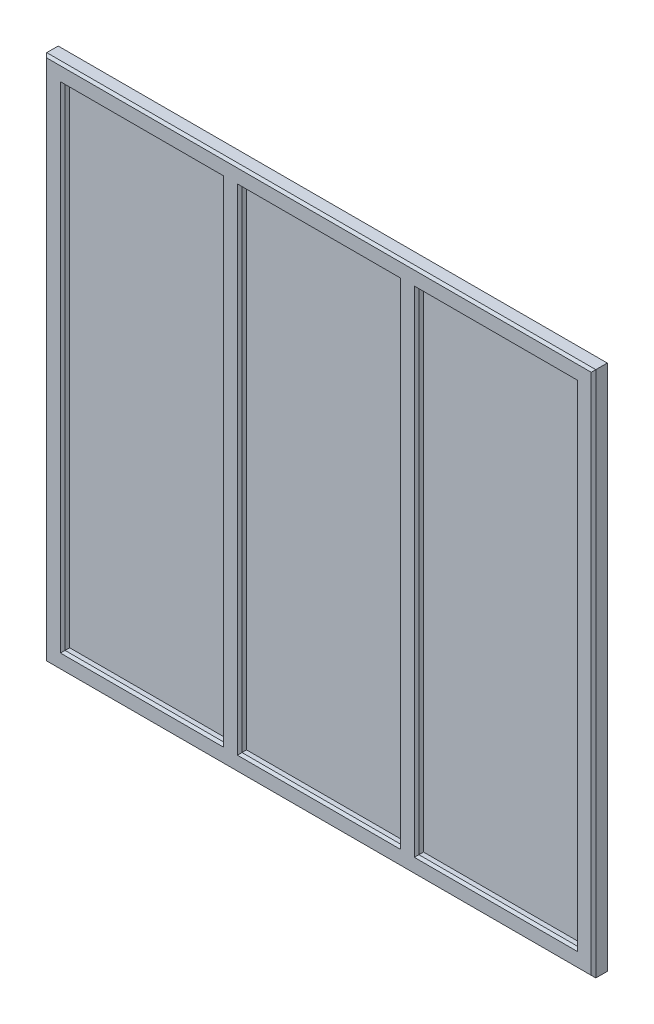
ISO-10303-21;
HEADER;
FILE_DESCRIPTION(('STEP AP214'),'2;1');
FILE_NAME('part.step','',(''),(''),'','','');
FILE_SCHEMA(('AUTOMOTIVE_DESIGN { 1 0 10303 214 1 1 1 1 }'));
ENDSEC;
DATA;
#1=APPLICATION_CONTEXT('core data for automotive mechanical design processes');
#2=APPLICATION_PROTOCOL_DEFINITION('international standard','automotive_design',2000,#1);
#3=PRODUCT_CONTEXT('',#1,'mechanical');
#4=PRODUCT('Part','Part','',(#3));
#5=PRODUCT_RELATED_PRODUCT_CATEGORY('part','',(#4));
#6=PRODUCT_DEFINITION_FORMATION('','',#4);
#7=PRODUCT_DEFINITION_CONTEXT('part definition',#1,'design');
#8=PRODUCT_DEFINITION('design','',#6,#7);
#9=PRODUCT_DEFINITION_SHAPE('','',#8);
#10=(LENGTH_UNIT() NAMED_UNIT(*) SI_UNIT(.MILLI.,.METRE.));
#11=(NAMED_UNIT(*) PLANE_ANGLE_UNIT() SI_UNIT($,.RADIAN.));
#12=(NAMED_UNIT(*) SI_UNIT($,.STERADIAN.) SOLID_ANGLE_UNIT());
#13=UNCERTAINTY_MEASURE_WITH_UNIT(LENGTH_MEASURE(1.E-05),#10,'distance_accuracy_value','');
#14=(GEOMETRIC_REPRESENTATION_CONTEXT(3) GLOBAL_UNCERTAINTY_ASSIGNED_CONTEXT((#13)) GLOBAL_UNIT_ASSIGNED_CONTEXT((#10,
#11,#12)) REPRESENTATION_CONTEXT('',''));
#15=CARTESIAN_POINT('',(0.,0.,0.));
#16=DIRECTION('',(0.,0.,1.));
#17=DIRECTION('',(1.,0.,0.));
#18=AXIS2_PLACEMENT_3D('',#15,#16,#17);
#19=CARTESIAN_POINT('',(2364.27043454507,2265.94362040315,30.));
#20=DIRECTION('',(1.,0.,0.));
#21=DIRECTION('',(0.,0.,-1.));
#22=AXIS2_PLACEMENT_3D('',#19,#20,#21);
#23=PLANE('',#22);
#24=DIRECTION('',(0.,-1.,0.));
#25=VECTOR('',#24,1.);
#26=CARTESIAN_POINT('',(2364.27043454507,2265.94362040315,20.));
#27=LINE('',#26,#25);
#28=CARTESIAN_POINT('',(2364.27043454507,2265.94362040315,20.));
#29=VERTEX_POINT('',#28);
#30=CARTESIAN_POINT('',(2364.27043454507,48.4287182260568,20.));
#31=VERTEX_POINT('',#30);
#32=EDGE_CURVE('E118',#29,#31,#27,.T.);
#33=ORIENTED_EDGE('',*,*,#32,.F.);
#34=DIRECTION('',(0.,0.,-1.));
#35=VECTOR('',#34,1.);
#36=CARTESIAN_POINT('',(2364.27043454507,2265.94362040315,30.));
#37=LINE('',#36,#35);
#38=CARTESIAN_POINT('',(2364.27043454507,2265.94362040315,30.));
#39=VERTEX_POINT('',#38);
#40=EDGE_CURVE('E12',#39,#29,#37,.T.);
#41=ORIENTED_EDGE('',*,*,#40,.F.);
#42=DIRECTION('',(0.,-1.,0.));
#43=VECTOR('',#42,1.);
#44=CARTESIAN_POINT('',(2364.27043454507,2265.94362040315,30.));
#45=LINE('',#44,#43);
#46=CARTESIAN_POINT('',(2364.27043454507,48.4287182260568,30.));
#47=VERTEX_POINT('',#46);
#48=EDGE_CURVE('E112',#39,#47,#45,.T.);
#49=ORIENTED_EDGE('',*,*,#48,.T.);
#50=DIRECTION('',(0.,0.,-1.));
#51=VECTOR('',#50,1.);
#52=CARTESIAN_POINT('',(2364.27043454507,48.4287182260568,30.));
#53=LINE('',#52,#51);
#54=EDGE_CURVE('E57',#47,#31,#53,.T.);
#55=ORIENTED_EDGE('',*,*,#54,.T.);
#56=EDGE_LOOP('',(#33,#41,#49,#55));
#57=FACE_BOUND('',#56,.T.);
#58=ADVANCED_FACE('F54',(#57),#23,.T.);
#59=CARTESIAN_POINT('',(2364.27043454507,2265.94362040315,30.));
#60=DIRECTION('',(0.,1.,0.));
#61=DIRECTION('',(0.,0.,1.));
#62=AXIS2_PLACEMENT_3D('',#59,#60,#61);
#63=PLANE('',#62);
#64=DIRECTION('',(1.,0.,0.));
#65=VECTOR('',#64,1.);
#66=CARTESIAN_POINT('',(2364.27043454507,2265.94362040315,20.));
#67=LINE('',#66,#65);
#68=CARTESIAN_POINT('',(56.6650057793351,2265.94362040315,20.));
#69=VERTEX_POINT('',#68);
#70=EDGE_CURVE('E114',#69,#29,#67,.T.);
#71=ORIENTED_EDGE('',*,*,#70,.F.);
#72=DIRECTION('',(0.,0.,-1.));
#73=VECTOR('',#72,1.);
#74=CARTESIAN_POINT('',(56.6650057793351,2265.94362040315,30.));
#75=LINE('',#74,#73);
#76=CARTESIAN_POINT('',(56.6650057793351,2265.94362040315,30.));
#77=VERTEX_POINT('',#76);
#78=EDGE_CURVE('E63',#77,#69,#75,.T.);
#79=ORIENTED_EDGE('',*,*,#78,.F.);
#80=DIRECTION('',(1.,0.,0.));
#81=VECTOR('',#80,1.);
#82=CARTESIAN_POINT('',(2364.27043454507,2265.94362040315,30.));
#83=LINE('',#82,#81);
#84=EDGE_CURVE('E109',#77,#39,#83,.T.);
#85=ORIENTED_EDGE('',*,*,#84,.T.);
#86=ORIENTED_EDGE('',*,*,#40,.T.);
#87=EDGE_LOOP('',(#71,#79,#85,#86));
#88=FACE_BOUND('',#87,.T.);
#89=ADVANCED_FACE('F128',(#88),#63,.T.);
#90=CARTESIAN_POINT('',(56.6650057793351,2265.94362040315,30.));
#91=DIRECTION('',(-1.,0.,0.));
#92=DIRECTION('',(0.,-1.,0.));
#93=AXIS2_PLACEMENT_3D('',#90,#91,#92);
#94=PLANE('',#93);
#95=DIRECTION('',(0.,1.,0.));
#96=VECTOR('',#95,1.);
#97=CARTESIAN_POINT('',(56.6650057793351,2265.94362040315,20.));
#98=LINE('',#97,#96);
#99=CARTESIAN_POINT('',(56.665005779335,48.4287182260568,20.));
#100=VERTEX_POINT('',#99);
#101=EDGE_CURVE('E104',#100,#69,#98,.T.);
#102=ORIENTED_EDGE('',*,*,#101,.F.);
#103=DIRECTION('',(0.,0.,-1.));
#104=VECTOR('',#103,1.);
#105=CARTESIAN_POINT('',(56.665005779335,48.4287182260568,30.));
#106=LINE('',#105,#104);
#107=CARTESIAN_POINT('',(56.665005779335,48.4287182260568,30.));
#108=VERTEX_POINT('',#107);
#109=EDGE_CURVE('E99',#108,#100,#106,.T.);
#110=ORIENTED_EDGE('',*,*,#109,.F.);
#111=DIRECTION('',(0.,1.,0.));
#112=VECTOR('',#111,1.);
#113=CARTESIAN_POINT('',(56.6650057793351,2265.94362040315,30.));
#114=LINE('',#113,#112);
#115=EDGE_CURVE('E102',#108,#77,#114,.T.);
#116=ORIENTED_EDGE('',*,*,#115,.T.);
#117=ORIENTED_EDGE('',*,*,#78,.T.);
#118=EDGE_LOOP('',(#102,#110,#116,#117));
#119=FACE_BOUND('',#118,.T.);
#120=ADVANCED_FACE('F101',(#119),#94,.T.);
#121=CARTESIAN_POINT('',(2364.27043454507,48.4287182260568,30.));
#122=DIRECTION('',(0.,-1.,0.));
#123=DIRECTION('',(0.,0.,-1.));
#124=AXIS2_PLACEMENT_3D('',#121,#122,#123);
#125=PLANE('',#124);
#126=DIRECTION('',(-1.,0.,0.));
#127=VECTOR('',#126,1.);
#128=CARTESIAN_POINT('',(2364.27043454507,48.4287182260568,20.));
#129=LINE('',#128,#127);
#130=EDGE_CURVE('E121',#31,#100,#129,.T.);
#131=ORIENTED_EDGE('',*,*,#130,.F.);
#132=ORIENTED_EDGE('',*,*,#54,.F.);
#133=DIRECTION('',(-1.,0.,0.));
#134=VECTOR('',#133,1.);
#135=CARTESIAN_POINT('',(2364.27043454507,48.4287182260568,30.));
#136=LINE('',#135,#134);
#137=EDGE_CURVE('E108',#47,#108,#136,.T.);
#138=ORIENTED_EDGE('',*,*,#137,.T.);
#139=ORIENTED_EDGE('',*,*,#109,.T.);
#140=EDGE_LOOP('',(#131,#132,#138,#139));
#141=FACE_BOUND('',#140,.T.);
#142=ADVANCED_FACE('F111',(#141),#125,.T.);
#143=CARTESIAN_POINT('',(0.,0.,30.));
#144=DIRECTION('',(0.,0.,-1.));
#145=DIRECTION('',(-1.,0.,0.));
#146=AXIS2_PLACEMENT_3D('',#143,#144,#145);
#147=PLANE('',#146);
#148=ORIENTED_EDGE('',*,*,#48,.F.);
#149=ORIENTED_EDGE('',*,*,#84,.F.);
#150=ORIENTED_EDGE('',*,*,#115,.F.);
#151=ORIENTED_EDGE('',*,*,#137,.F.);
#152=EDGE_LOOP('',(#148,#149,#150,#151));
#153=FACE_BOUND('',#152,.T.);
#154=ADVANCED_FACE('F107',(#153),#147,.F.);
#155=CARTESIAN_POINT('',(0.,0.,20.));
#156=DIRECTION('',(0.,0.,-1.));
#157=DIRECTION('',(-1.,0.,0.));
#158=AXIS2_PLACEMENT_3D('',#155,#156,#157);
#159=PLANE('',#158);
#160=ORIENTED_EDGE('',*,*,#32,.T.);
#161=ORIENTED_EDGE('',*,*,#130,.T.);
#162=ORIENTED_EDGE('',*,*,#101,.T.);
#163=ORIENTED_EDGE('',*,*,#70,.T.);
#164=EDGE_LOOP('',(#160,#161,#162,#163));
#165=FACE_BOUND('',#164,.T.);
#166=ADVANCED_FACE('F127',(#165),#159,.T.);
#167=CLOSED_SHELL('',(#58,#89,#120,#142,#154,#166));
#168=MANIFOLD_SOLID_BREP('B2',#167);
#169=CARTESIAN_POINT('',(0.,0.,60.));
#170=DIRECTION('',(0.,0.,-1.));
#171=DIRECTION('',(-1.,0.,0.));
#172=AXIS2_PLACEMENT_3D('',#169,#170,#171);
#173=PLANE('',#172);
#174=DIRECTION('',(-1.,0.,0.));
#175=VECTOR('',#174,1.);
#176=CARTESIAN_POINT('',(852.333333333334,70.0000000000003,60.));
#177=LINE('',#176,#175);
#178=CARTESIAN_POINT('',(1554.66666666667,70.0000000000003,60.));
#179=VERTEX_POINT('',#178);
#180=CARTESIAN_POINT('',(842.333333333334,70.0000000000003,60.));
#181=VERTEX_POINT('',#180);
#182=EDGE_CURVE('E472',#179,#181,#177,.T.);
#183=ORIENTED_EDGE('',*,*,#182,.T.);
#184=DIRECTION('',(0.,1.,0.));
#185=VECTOR('',#184,1.);
#186=CARTESIAN_POINT('',(842.333333333334,2220.,60.));
#187=LINE('',#186,#185);
#188=CARTESIAN_POINT('',(842.333333333334,2230.,60.));
#189=VERTEX_POINT('',#188);
#190=EDGE_CURVE('E474',#181,#189,#187,.T.);
#191=ORIENTED_EDGE('',*,*,#190,.T.);
#192=DIRECTION('',(1.,0.,0.));
#193=VECTOR('',#192,1.);
#194=CARTESIAN_POINT('',(1544.66666666667,2230.,60.));
#195=LINE('',#194,#193);
#196=CARTESIAN_POINT('',(1554.66666666667,2230.,60.));
#197=VERTEX_POINT('',#196);
#198=EDGE_CURVE('E468',#189,#197,#195,.T.);
#199=ORIENTED_EDGE('',*,*,#198,.T.);
#200=DIRECTION('',(0.,-1.,0.));
#201=VECTOR('',#200,1.);
#202=CARTESIAN_POINT('',(1554.66666666667,80.0000000000001,60.));
#203=LINE('',#202,#201);
#204=EDGE_CURVE('E470',#197,#179,#203,.T.);
#205=ORIENTED_EDGE('',*,*,#204,.T.);
#206=EDGE_LOOP('',(#183,#191,#199,#205));
#207=FACE_BOUND('',#206,.T.);
#208=DIRECTION('',(1.,0.,0.));
#209=VECTOR('',#208,1.);
#210=CARTESIAN_POINT('',(772.333333333334,2230.,60.));
#211=LINE('',#210,#209);
#212=CARTESIAN_POINT('',(70.0000000000002,2230.,60.));
#213=VERTEX_POINT('',#212);
#214=CARTESIAN_POINT('',(782.333333333333,2230.,60.));
#215=VERTEX_POINT('',#214);
#216=EDGE_CURVE('E463',#213,#215,#211,.T.);
#217=ORIENTED_EDGE('',*,*,#216,.T.);
#218=DIRECTION('',(0.,-1.,0.));
#219=VECTOR('',#218,1.);
#220=CARTESIAN_POINT('',(782.333333333333,80.0000000000001,60.));
#221=LINE('',#220,#219);
#222=CARTESIAN_POINT('',(782.333333333333,70.0000000000003,60.));
#223=VERTEX_POINT('',#222);
#224=EDGE_CURVE('E465',#215,#223,#221,.T.);
#225=ORIENTED_EDGE('',*,*,#224,.T.);
#226=DIRECTION('',(-1.,0.,0.));
#227=VECTOR('',#226,1.);
#228=CARTESIAN_POINT('',(80.,70.0000000000002,60.));
#229=LINE('',#228,#227);
#230=CARTESIAN_POINT('',(70.0000000000002,70.0000000000002,60.));
#231=VERTEX_POINT('',#230);
#232=EDGE_CURVE('E459',#223,#231,#229,.T.);
#233=ORIENTED_EDGE('',*,*,#232,.T.);
#234=DIRECTION('',(0.,1.,0.));
#235=VECTOR('',#234,1.);
#236=CARTESIAN_POINT('',(70.0000000000002,2220.,60.));
#237=LINE('',#236,#235);
#238=EDGE_CURVE('E461',#231,#213,#237,.T.);
#239=ORIENTED_EDGE('',*,*,#238,.T.);
#240=EDGE_LOOP('',(#217,#225,#233,#239));
#241=FACE_BOUND('',#240,.T.);
#242=DIRECTION('',(0.,1.,0.));
#243=VECTOR('',#242,1.);
#244=CARTESIAN_POINT('',(2387.,0.,60.));
#245=LINE('',#244,#243);
#246=CARTESIAN_POINT('',(2387.,10.0000000000002,60.));
#247=VERTEX_POINT('',#246);
#248=CARTESIAN_POINT('',(2387.,2290.,60.));
#249=VERTEX_POINT('',#248);
#250=EDGE_CURVE('E454',#247,#249,#245,.T.);
#251=ORIENTED_EDGE('',*,*,#250,.T.);
#252=DIRECTION('',(-1.,0.,0.));
#253=VECTOR('',#252,1.);
#254=CARTESIAN_POINT('',(0.,2290.,60.));
#255=LINE('',#254,#253);
#256=CARTESIAN_POINT('',(10.0000000000002,2290.,60.));
#257=VERTEX_POINT('',#256);
#258=EDGE_CURVE('E456',#249,#257,#255,.T.);
#259=ORIENTED_EDGE('',*,*,#258,.T.);
#260=DIRECTION('',(0.,-1.,0.));
#261=VECTOR('',#260,1.);
#262=CARTESIAN_POINT('',(10.0000000000002,0.,60.));
#263=LINE('',#262,#261);
#264=CARTESIAN_POINT('',(10.0000000000002,10.0000000000002,60.));
#265=VERTEX_POINT('',#264);
#266=EDGE_CURVE('E450',#257,#265,#263,.T.);
#267=ORIENTED_EDGE('',*,*,#266,.T.);
#268=DIRECTION('',(1.,0.,0.));
#269=VECTOR('',#268,1.);
#270=CARTESIAN_POINT('',(0.,10.0000000000002,60.));
#271=LINE('',#270,#269);
#272=EDGE_CURVE('E452',#265,#247,#271,.T.);
#273=ORIENTED_EDGE('',*,*,#272,.T.);
#274=EDGE_LOOP('',(#251,#259,#267,#273));
#275=FACE_BOUND('',#274,.T.);
#276=DIRECTION('',(-1.,0.,0.));
#277=VECTOR('',#276,1.);
#278=CARTESIAN_POINT('',(1624.66666666667,70.0000000000003,60.));
#279=LINE('',#278,#277);
#280=CARTESIAN_POINT('',(2327.,70.0000000000002,60.));
#281=VERTEX_POINT('',#280);
#282=CARTESIAN_POINT('',(1614.66666666667,70.0000000000003,60.));
#283=VERTEX_POINT('',#282);
#284=EDGE_CURVE('E445',#281,#283,#279,.T.);
#285=ORIENTED_EDGE('',*,*,#284,.T.);
#286=DIRECTION('',(0.,1.,0.));
#287=VECTOR('',#286,1.);
#288=CARTESIAN_POINT('',(1614.66666666667,2220.,60.));
#289=LINE('',#288,#287);
#290=CARTESIAN_POINT('',(1614.66666666667,2230.,60.));
#291=VERTEX_POINT('',#290);
#292=EDGE_CURVE('E447',#283,#291,#289,.T.);
#293=ORIENTED_EDGE('',*,*,#292,.T.);
#294=DIRECTION('',(1.,0.,0.));
#295=VECTOR('',#294,1.);
#296=CARTESIAN_POINT('',(2317.,2230.,60.));
#297=LINE('',#296,#295);
#298=CARTESIAN_POINT('',(2327.,2230.,60.));
#299=VERTEX_POINT('',#298);
#300=EDGE_CURVE('E441',#291,#299,#297,.T.);
#301=ORIENTED_EDGE('',*,*,#300,.T.);
#302=DIRECTION('',(0.,-1.,0.));
#303=VECTOR('',#302,1.);
#304=CARTESIAN_POINT('',(2327.,80.,60.));
#305=LINE('',#304,#303);
#306=EDGE_CURVE('E443',#299,#281,#305,.T.);
#307=ORIENTED_EDGE('',*,*,#306,.T.);
#308=EDGE_LOOP('',(#285,#293,#301,#307));
#309=FACE_BOUND('',#308,.T.);
#310=ADVANCED_FACE('F177',(#207,#241,#275,#309),#173,.F.);
#311=CARTESIAN_POINT('',(0.,0.,0.));
#312=DIRECTION('',(0.,0.,-1.));
#313=DIRECTION('',(-1.,0.,0.));
#314=AXIS2_PLACEMENT_3D('',#311,#312,#313);
#315=PLANE('',#314);
#316=DIRECTION('',(0.,-1.,0.));
#317=VECTOR('',#316,1.);
#318=CARTESIAN_POINT('',(0.,0.,0.));
#319=LINE('',#318,#317);
#320=CARTESIAN_POINT('',(0.,2300.,0.));
#321=VERTEX_POINT('',#320);
#322=CARTESIAN_POINT('',(0.,0.,0.));
#323=VERTEX_POINT('',#322);
#324=EDGE_CURVE('E419',#321,#323,#319,.T.);
#325=ORIENTED_EDGE('',*,*,#324,.F.);
#326=DIRECTION('',(-1.,0.,0.));
#327=VECTOR('',#326,1.);
#328=CARTESIAN_POINT('',(0.,2300.,0.));
#329=LINE('',#328,#327);
#330=CARTESIAN_POINT('',(2397.,2300.,0.));
#331=VERTEX_POINT('',#330);
#332=EDGE_CURVE('E428',#331,#321,#329,.T.);
#333=ORIENTED_EDGE('',*,*,#332,.F.);
#334=DIRECTION('',(0.,1.,0.));
#335=VECTOR('',#334,1.);
#336=CARTESIAN_POINT('',(2397.,0.,0.));
#337=LINE('',#336,#335);
#338=CARTESIAN_POINT('',(2397.,0.,0.));
#339=VERTEX_POINT('',#338);
#340=EDGE_CURVE('E425',#339,#331,#337,.T.);
#341=ORIENTED_EDGE('',*,*,#340,.F.);
#342=DIRECTION('',(1.,0.,0.));
#343=VECTOR('',#342,1.);
#344=CARTESIAN_POINT('',(0.,0.,0.));
#345=LINE('',#344,#343);
#346=EDGE_CURVE('E422',#323,#339,#345,.T.);
#347=ORIENTED_EDGE('',*,*,#346,.F.);
#348=EDGE_LOOP('',(#325,#333,#341,#347));
#349=FACE_BOUND('',#348,.T.);
#350=DIRECTION('',(0.,-1.,0.));
#351=VECTOR('',#350,1.);
#352=CARTESIAN_POINT('',(80.,80.,0.));
#353=LINE('',#352,#351);
#354=CARTESIAN_POINT('',(80.,2220.,0.));
#355=VERTEX_POINT('',#354);
#356=CARTESIAN_POINT('',(80.,80.,0.));
#357=VERTEX_POINT('',#356);
#358=EDGE_CURVE('E408',#355,#357,#353,.T.);
#359=ORIENTED_EDGE('',*,*,#358,.T.);
#360=DIRECTION('',(1.,0.,0.));
#361=VECTOR('',#360,1.);
#362=CARTESIAN_POINT('',(80.,80.,0.));
#363=LINE('',#362,#361);
#364=CARTESIAN_POINT('',(772.333333333334,80.0000000000001,0.));
#365=VERTEX_POINT('',#364);
#366=EDGE_CURVE('E399',#357,#365,#363,.T.);
#367=ORIENTED_EDGE('',*,*,#366,.T.);
#368=DIRECTION('',(0.,1.,0.));
#369=VECTOR('',#368,1.);
#370=CARTESIAN_POINT('',(772.333333333334,2220.,0.));
#371=LINE('',#370,#369);
#372=CARTESIAN_POINT('',(772.333333333334,2220.,0.));
#373=VERTEX_POINT('',#372);
#374=EDGE_CURVE('E402',#365,#373,#371,.T.);
#375=ORIENTED_EDGE('',*,*,#374,.T.);
#376=DIRECTION('',(-1.,0.,0.));
#377=VECTOR('',#376,1.);
#378=CARTESIAN_POINT('',(80.,2220.,0.));
#379=LINE('',#378,#377);
#380=EDGE_CURVE('E405',#373,#355,#379,.T.);
#381=ORIENTED_EDGE('',*,*,#380,.T.);
#382=EDGE_LOOP('',(#359,#367,#375,#381));
#383=FACE_BOUND('',#382,.T.);
#384=DIRECTION('',(0.,1.,0.));
#385=VECTOR('',#384,1.);
#386=CARTESIAN_POINT('',(2317.,80.,0.));
#387=LINE('',#386,#385);
#388=CARTESIAN_POINT('',(2317.,80.,0.));
#389=VERTEX_POINT('',#388);
#390=CARTESIAN_POINT('',(2317.,2220.,0.));
#391=VERTEX_POINT('',#390);
#392=EDGE_CURVE('E388',#389,#391,#387,.T.);
#393=ORIENTED_EDGE('',*,*,#392,.T.);
#394=DIRECTION('',(-1.,0.,0.));
#395=VECTOR('',#394,1.);
#396=CARTESIAN_POINT('',(1624.66666666667,2220.,0.));
#397=LINE('',#396,#395);
#398=CARTESIAN_POINT('',(1624.66666666667,2220.,0.));
#399=VERTEX_POINT('',#398);
#400=EDGE_CURVE('E352',#391,#399,#397,.T.);
#401=ORIENTED_EDGE('',*,*,#400,.T.);
#402=DIRECTION('',(0.,-1.,0.));
#403=VECTOR('',#402,1.);
#404=CARTESIAN_POINT('',(1624.66666666667,2220.,0.));
#405=LINE('',#404,#403);
#406=CARTESIAN_POINT('',(1624.66666666667,80.0000000000001,0.));
#407=VERTEX_POINT('',#406);
#408=EDGE_CURVE('E382',#399,#407,#405,.T.);
#409=ORIENTED_EDGE('',*,*,#408,.T.);
#410=DIRECTION('',(1.,0.,0.));
#411=VECTOR('',#410,1.);
#412=CARTESIAN_POINT('',(1624.66666666667,80.0000000000001,0.));
#413=LINE('',#412,#411);
#414=EDGE_CURVE('E385',#407,#389,#413,.T.);
#415=ORIENTED_EDGE('',*,*,#414,.T.);
#416=EDGE_LOOP('',(#393,#401,#409,#415));
#417=FACE_BOUND('',#416,.T.);
#418=DIRECTION('',(0.,1.,0.));
#419=VECTOR('',#418,1.);
#420=CARTESIAN_POINT('',(1544.66666666667,2220.,0.));
#421=LINE('',#420,#419);
#422=CARTESIAN_POINT('',(1544.66666666667,80.0000000000001,0.));
#423=VERTEX_POINT('',#422);
#424=CARTESIAN_POINT('',(1544.66666666667,2220.,0.));
#425=VERTEX_POINT('',#424);
#426=EDGE_CURVE('E366',#423,#425,#421,.T.);
#427=ORIENTED_EDGE('',*,*,#426,.T.);
#428=DIRECTION('',(-1.,0.,0.));
#429=VECTOR('',#428,1.);
#430=CARTESIAN_POINT('',(852.333333333334,2220.,0.));
#431=LINE('',#430,#429);
#432=CARTESIAN_POINT('',(852.333333333334,2220.,0.));
#433=VERTEX_POINT('',#432);
#434=EDGE_CURVE('E345',#425,#433,#431,.T.);
#435=ORIENTED_EDGE('',*,*,#434,.T.);
#436=DIRECTION('',(0.,-1.,0.));
#437=VECTOR('',#436,1.);
#438=CARTESIAN_POINT('',(852.333333333334,2220.,0.));
#439=LINE('',#438,#437);
#440=CARTESIAN_POINT('',(852.333333333334,80.0000000000001,0.));
#441=VERTEX_POINT('',#440);
#442=EDGE_CURVE('E356',#433,#441,#439,.T.);
#443=ORIENTED_EDGE('',*,*,#442,.T.);
#444=DIRECTION('',(1.,0.,0.));
#445=VECTOR('',#444,1.);
#446=CARTESIAN_POINT('',(852.333333333334,80.0000000000001,0.));
#447=LINE('',#446,#445);
#448=EDGE_CURVE('E362',#441,#423,#447,.T.);
#449=ORIENTED_EDGE('',*,*,#448,.T.);
#450=EDGE_LOOP('',(#427,#435,#443,#449));
#451=FACE_BOUND('',#450,.T.);
#452=ADVANCED_FACE('F364',(#349,#383,#417,#451),#315,.T.);
#453=CARTESIAN_POINT('',(0.,0.,60.));
#454=DIRECTION('',(1.,0.,0.));
#455=DIRECTION('',(0.,0.,-1.));
#456=AXIS2_PLACEMENT_3D('',#453,#454,#455);
#457=PLANE('',#456);
#458=DIRECTION('',(0.,0.,-1.));
#459=VECTOR('',#458,1.);
#460=CARTESIAN_POINT('',(0.,0.,60.));
#461=LINE('',#460,#459);
#462=CARTESIAN_POINT('',(0.,0.,49.9999999999998));
#463=VERTEX_POINT('',#462);
#464=EDGE_CURVE('E437',#463,#323,#461,.T.);
#465=ORIENTED_EDGE('',*,*,#464,.F.);
#466=DIRECTION('',(0.,1.,0.));
#467=VECTOR('',#466,1.);
#468=CARTESIAN_POINT('',(0.,0.,49.9999999999998));
#469=LINE('',#468,#467);
#470=CARTESIAN_POINT('',(0.,2300.,49.9999999999998));
#471=VERTEX_POINT('',#470);
#472=EDGE_CURVE('E498',#463,#471,#469,.T.);
#473=ORIENTED_EDGE('',*,*,#472,.T.);
#474=DIRECTION('',(0.,0.,-1.));
#475=VECTOR('',#474,1.);
#476=CARTESIAN_POINT('',(0.,2300.,60.));
#477=LINE('',#476,#475);
#478=EDGE_CURVE('E431',#471,#321,#477,.T.);
#479=ORIENTED_EDGE('',*,*,#478,.T.);
#480=ORIENTED_EDGE('',*,*,#324,.T.);
#481=EDGE_LOOP('',(#465,#473,#479,#480));
#482=FACE_BOUND('',#481,.T.);
#483=ADVANCED_FACE('F582',(#482),#457,.F.);
#484=CARTESIAN_POINT('',(0.,0.,60.));
#485=DIRECTION('',(0.,1.,0.));
#486=DIRECTION('',(0.,0.,1.));
#487=AXIS2_PLACEMENT_3D('',#484,#485,#486);
#488=PLANE('',#487);
#489=DIRECTION('',(0.,0.,-1.));
#490=VECTOR('',#489,1.);
#491=CARTESIAN_POINT('',(2397.,0.,60.));
#492=LINE('',#491,#490);
#493=CARTESIAN_POINT('',(2397.,0.,49.9999999999998));
#494=VERTEX_POINT('',#493);
#495=EDGE_CURVE('E435',#494,#339,#492,.T.);
#496=ORIENTED_EDGE('',*,*,#495,.F.);
#497=DIRECTION('',(-1.,0.,0.));
#498=VECTOR('',#497,1.);
#499=CARTESIAN_POINT('',(0.,0.,49.9999999999998));
#500=LINE('',#499,#498);
#501=EDGE_CURVE('E496',#494,#463,#500,.T.);
#502=ORIENTED_EDGE('',*,*,#501,.T.);
#503=ORIENTED_EDGE('',*,*,#464,.T.);
#504=ORIENTED_EDGE('',*,*,#346,.T.);
#505=EDGE_LOOP('',(#496,#502,#503,#504));
#506=FACE_BOUND('',#505,.T.);
#507=ADVANCED_FACE('F597',(#506),#488,.F.);
#508=CARTESIAN_POINT('',(2397.,0.,60.));
#509=DIRECTION('',(-1.,0.,0.));
#510=DIRECTION('',(0.,0.,1.));
#511=AXIS2_PLACEMENT_3D('',#508,#509,#510);
#512=PLANE('',#511);
#513=DIRECTION('',(0.,0.,-1.));
#514=VECTOR('',#513,1.);
#515=CARTESIAN_POINT('',(2397.,2300.,60.));
#516=LINE('',#515,#514);
#517=CARTESIAN_POINT('',(2397.,2300.,49.9999999999998));
#518=VERTEX_POINT('',#517);
#519=EDGE_CURVE('E433',#518,#331,#516,.T.);
#520=ORIENTED_EDGE('',*,*,#519,.F.);
#521=DIRECTION('',(0.,-1.,0.));
#522=VECTOR('',#521,1.);
#523=CARTESIAN_POINT('',(2397.,0.,49.9999999999998));
#524=LINE('',#523,#522);
#525=EDGE_CURVE('E494',#518,#494,#524,.T.);
#526=ORIENTED_EDGE('',*,*,#525,.T.);
#527=ORIENTED_EDGE('',*,*,#495,.T.);
#528=ORIENTED_EDGE('',*,*,#340,.T.);
#529=EDGE_LOOP('',(#520,#526,#527,#528));
#530=FACE_BOUND('',#529,.T.);
#531=ADVANCED_FACE('F593',(#530),#512,.F.);
#532=CARTESIAN_POINT('',(0.,2300.,60.));
#533=DIRECTION('',(0.,-1.,0.));
#534=DIRECTION('',(0.,0.,-1.));
#535=AXIS2_PLACEMENT_3D('',#532,#533,#534);
#536=PLANE('',#535);
#537=ORIENTED_EDGE('',*,*,#478,.F.);
#538=DIRECTION('',(1.,0.,0.));
#539=VECTOR('',#538,1.);
#540=CARTESIAN_POINT('',(0.,2300.,49.9999999999998));
#541=LINE('',#540,#539);
#542=EDGE_CURVE('E491',#471,#518,#541,.T.);
#543=ORIENTED_EDGE('',*,*,#542,.T.);
#544=ORIENTED_EDGE('',*,*,#519,.T.);
#545=ORIENTED_EDGE('',*,*,#332,.T.);
#546=EDGE_LOOP('',(#537,#543,#544,#545));
#547=FACE_BOUND('',#546,.T.);
#548=ADVANCED_FACE('F590',(#547),#536,.F.);
#549=CARTESIAN_POINT('',(80.,80.,60.));
#550=DIRECTION('',(0.,1.,0.));
#551=DIRECTION('',(-1.,0.,0.));
#552=AXIS2_PLACEMENT_3D('',#549,#550,#551);
#553=PLANE('',#552);
#554=DIRECTION('',(0.,0.,-1.));
#555=VECTOR('',#554,1.);
#556=CARTESIAN_POINT('',(80.,80.,60.));
#557=LINE('',#556,#555);
#558=CARTESIAN_POINT('',(80.,80.,49.9999999999998));
#559=VERTEX_POINT('',#558);
#560=EDGE_CURVE('E411',#559,#357,#557,.T.);
#561=ORIENTED_EDGE('',*,*,#560,.F.);
#562=DIRECTION('',(1.,0.,0.));
#563=VECTOR('',#562,1.);
#564=CARTESIAN_POINT('',(772.333333333334,80.0000000000001,49.9999999999998));
#565=LINE('',#564,#563);
#566=CARTESIAN_POINT('',(772.333333333334,80.0000000000001,49.9999999999998));
#567=VERTEX_POINT('',#566);
#568=EDGE_CURVE('E489',#559,#567,#565,.T.);
#569=ORIENTED_EDGE('',*,*,#568,.T.);
#570=DIRECTION('',(0.,0.,-1.));
#571=VECTOR('',#570,1.);
#572=CARTESIAN_POINT('',(772.333333333334,80.0000000000001,60.));
#573=LINE('',#572,#571);
#574=EDGE_CURVE('E417',#567,#365,#573,.T.);
#575=ORIENTED_EDGE('',*,*,#574,.T.);
#576=ORIENTED_EDGE('',*,*,#366,.F.);
#577=EDGE_LOOP('',(#561,#569,#575,#576));
#578=FACE_BOUND('',#577,.T.);
#579=ADVANCED_FACE('F587',(#578),#553,.T.);
#580=CARTESIAN_POINT('',(772.333333333334,2220.,60.));
#581=DIRECTION('',(-1.,0.,0.));
#582=DIRECTION('',(0.,0.,1.));
#583=AXIS2_PLACEMENT_3D('',#580,#581,#582);
#584=PLANE('',#583);
#585=ORIENTED_EDGE('',*,*,#574,.F.);
#586=DIRECTION('',(0.,1.,0.));
#587=VECTOR('',#586,1.);
#588=CARTESIAN_POINT('',(772.333333333334,2220.,49.9999999999998));
#589=LINE('',#588,#587);
#590=CARTESIAN_POINT('',(772.333333333334,2220.,49.9999999999998));
#591=VERTEX_POINT('',#590);
#592=EDGE_CURVE('E482',#567,#591,#589,.T.);
#593=ORIENTED_EDGE('',*,*,#592,.T.);
#594=DIRECTION('',(0.,0.,-1.));
#595=VECTOR('',#594,1.);
#596=CARTESIAN_POINT('',(772.333333333334,2220.,60.));
#597=LINE('',#596,#595);
#598=EDGE_CURVE('E415',#591,#373,#597,.T.);
#599=ORIENTED_EDGE('',*,*,#598,.T.);
#600=ORIENTED_EDGE('',*,*,#374,.F.);
#601=EDGE_LOOP('',(#585,#593,#599,#600));
#602=FACE_BOUND('',#601,.T.);
#603=ADVANCED_FACE('F843',(#602),#584,.T.);
#604=CARTESIAN_POINT('',(80.,2220.,60.));
#605=DIRECTION('',(0.,-1.,0.));
#606=DIRECTION('',(0.,0.,-1.));
#607=AXIS2_PLACEMENT_3D('',#604,#605,#606);
#608=PLANE('',#607);
#609=ORIENTED_EDGE('',*,*,#598,.F.);
#610=DIRECTION('',(-1.,0.,0.));
#611=VECTOR('',#610,1.);
#612=CARTESIAN_POINT('',(80.,2220.,49.9999999999998));
#613=LINE('',#612,#611);
#614=CARTESIAN_POINT('',(80.,2220.,49.9999999999998));
#615=VERTEX_POINT('',#614);
#616=EDGE_CURVE('E485',#591,#615,#613,.T.);
#617=ORIENTED_EDGE('',*,*,#616,.T.);
#618=DIRECTION('',(0.,0.,-1.));
#619=VECTOR('',#618,1.);
#620=CARTESIAN_POINT('',(80.,2220.,60.));
#621=LINE('',#620,#619);
#622=EDGE_CURVE('E413',#615,#355,#621,.T.);
#623=ORIENTED_EDGE('',*,*,#622,.T.);
#624=ORIENTED_EDGE('',*,*,#380,.F.);
#625=EDGE_LOOP('',(#609,#617,#623,#624));
#626=FACE_BOUND('',#625,.T.);
#627=ADVANCED_FACE('F833',(#626),#608,.T.);
#628=CARTESIAN_POINT('',(80.,80.,60.));
#629=DIRECTION('',(1.,0.,0.));
#630=DIRECTION('',(0.,0.,-1.));
#631=AXIS2_PLACEMENT_3D('',#628,#629,#630);
#632=PLANE('',#631);
#633=ORIENTED_EDGE('',*,*,#622,.F.);
#634=DIRECTION('',(0.,-1.,0.));
#635=VECTOR('',#634,1.);
#636=CARTESIAN_POINT('',(80.,80.,49.9999999999998));
#637=LINE('',#636,#635);
#638=EDGE_CURVE('E487',#615,#559,#637,.T.);
#639=ORIENTED_EDGE('',*,*,#638,.T.);
#640=ORIENTED_EDGE('',*,*,#560,.T.);
#641=ORIENTED_EDGE('',*,*,#358,.F.);
#642=EDGE_LOOP('',(#633,#639,#640,#641));
#643=FACE_BOUND('',#642,.T.);
#644=ADVANCED_FACE('F824',(#643),#632,.T.);
#645=CARTESIAN_POINT('',(1624.66666666667,2220.,60.));
#646=DIRECTION('',(0.,-1.,0.));
#647=DIRECTION('',(0.,0.,-1.));
#648=AXIS2_PLACEMENT_3D('',#645,#646,#647);
#649=PLANE('',#648);
#650=DIRECTION('',(0.,0.,-1.));
#651=VECTOR('',#650,1.);
#652=CARTESIAN_POINT('',(2317.,2220.,60.));
#653=LINE('',#652,#651);
#654=CARTESIAN_POINT('',(2317.,2220.,49.9999999999998));
#655=VERTEX_POINT('',#654);
#656=EDGE_CURVE('E391',#655,#391,#653,.T.);
#657=ORIENTED_EDGE('',*,*,#656,.F.);
#658=DIRECTION('',(-1.,0.,0.));
#659=VECTOR('',#658,1.);
#660=CARTESIAN_POINT('',(1624.66666666667,2220.,49.9999999999998));
#661=LINE('',#660,#659);
#662=CARTESIAN_POINT('',(1624.66666666667,2220.,49.9999999999998));
#663=VERTEX_POINT('',#662);
#664=EDGE_CURVE('E52',#655,#663,#661,.T.);
#665=ORIENTED_EDGE('',*,*,#664,.T.);
#666=DIRECTION('',(0.,0.,-1.));
#667=VECTOR('',#666,1.);
#668=CARTESIAN_POINT('',(1624.66666666667,2220.,60.));
#669=LINE('',#668,#667);
#670=EDGE_CURVE('E397',#663,#399,#669,.T.);
#671=ORIENTED_EDGE('',*,*,#670,.T.);
#672=ORIENTED_EDGE('',*,*,#400,.F.);
#673=EDGE_LOOP('',(#657,#665,#671,#672));
#674=FACE_BOUND('',#673,.T.);
#675=ADVANCED_FACE('F565',(#674),#649,.T.);
#676=CARTESIAN_POINT('',(1624.66666666667,2220.,60.));
#677=DIRECTION('',(1.,0.,0.));
#678=DIRECTION('',(0.,0.,-1.));
#679=AXIS2_PLACEMENT_3D('',#676,#677,#678);
#680=PLANE('',#679);
#681=ORIENTED_EDGE('',*,*,#670,.F.);
#682=DIRECTION('',(0.,-1.,0.));
#683=VECTOR('',#682,1.);
#684=CARTESIAN_POINT('',(1624.66666666667,80.0000000000001,49.9999999999998));
#685=LINE('',#684,#683);
#686=CARTESIAN_POINT('',(1624.66666666667,80.0000000000001,49.9999999999998));
#687=VERTEX_POINT('',#686);
#688=EDGE_CURVE('E500',#663,#687,#685,.T.);
#689=ORIENTED_EDGE('',*,*,#688,.T.);
#690=DIRECTION('',(0.,0.,-1.));
#691=VECTOR('',#690,1.);
#692=CARTESIAN_POINT('',(1624.66666666667,80.0000000000001,60.));
#693=LINE('',#692,#691);
#694=EDGE_CURVE('E395',#687,#407,#693,.T.);
#695=ORIENTED_EDGE('',*,*,#694,.T.);
#696=ORIENTED_EDGE('',*,*,#408,.F.);
#697=EDGE_LOOP('',(#681,#689,#695,#696));
#698=FACE_BOUND('',#697,.T.);
#699=ADVANCED_FACE('F557',(#698),#680,.T.);
#700=CARTESIAN_POINT('',(1624.66666666667,80.0000000000001,60.));
#701=DIRECTION('',(0.,1.,0.));
#702=DIRECTION('',(-1.,0.,0.));
#703=AXIS2_PLACEMENT_3D('',#700,#701,#702);
#704=PLANE('',#703);
#705=ORIENTED_EDGE('',*,*,#694,.F.);
#706=DIRECTION('',(1.,0.,0.));
#707=VECTOR('',#706,1.);
#708=CARTESIAN_POINT('',(2317.,80.,49.9999999999998));
#709=LINE('',#708,#707);
#710=CARTESIAN_POINT('',(2317.,80.,49.9999999999998));
#711=VERTEX_POINT('',#710);
#712=EDGE_CURVE('E202',#687,#711,#709,.T.);
#713=ORIENTED_EDGE('',*,*,#712,.T.);
#714=DIRECTION('',(0.,0.,-1.));
#715=VECTOR('',#714,1.);
#716=CARTESIAN_POINT('',(2317.,80.,60.));
#717=LINE('',#716,#715);
#718=EDGE_CURVE('E393',#711,#389,#717,.T.);
#719=ORIENTED_EDGE('',*,*,#718,.T.);
#720=ORIENTED_EDGE('',*,*,#414,.F.);
#721=EDGE_LOOP('',(#705,#713,#719,#720));
#722=FACE_BOUND('',#721,.T.);
#723=ADVANCED_FACE('F560',(#722),#704,.T.);
#724=CARTESIAN_POINT('',(2317.,80.,60.));
#725=DIRECTION('',(-1.,0.,0.));
#726=DIRECTION('',(0.,0.,1.));
#727=AXIS2_PLACEMENT_3D('',#724,#725,#726);
#728=PLANE('',#727);
#729=ORIENTED_EDGE('',*,*,#718,.F.);
#730=DIRECTION('',(0.,1.,0.));
#731=VECTOR('',#730,1.);
#732=CARTESIAN_POINT('',(2317.,2220.,49.9999999999998));
#733=LINE('',#732,#731);
#734=EDGE_CURVE('E187',#711,#655,#733,.T.);
#735=ORIENTED_EDGE('',*,*,#734,.T.);
#736=ORIENTED_EDGE('',*,*,#656,.T.);
#737=ORIENTED_EDGE('',*,*,#392,.F.);
#738=EDGE_LOOP('',(#729,#735,#736,#737));
#739=FACE_BOUND('',#738,.T.);
#740=ADVANCED_FACE('F566',(#739),#728,.T.);
#741=CARTESIAN_POINT('',(852.333333333334,2220.,60.));
#742=DIRECTION('',(0.,-1.,0.));
#743=DIRECTION('',(0.,0.,-1.));
#744=AXIS2_PLACEMENT_3D('',#741,#742,#743);
#745=PLANE('',#744);
#746=DIRECTION('',(0.,0.,-1.));
#747=VECTOR('',#746,1.);
#748=CARTESIAN_POINT('',(1544.66666666667,2220.,60.));
#749=LINE('',#748,#747);
#750=CARTESIAN_POINT('',(1544.66666666667,2220.,49.9999999999998));
#751=VERTEX_POINT('',#750);
#752=EDGE_CURVE('E375',#751,#425,#749,.T.);
#753=ORIENTED_EDGE('',*,*,#752,.F.);
#754=DIRECTION('',(-1.,0.,0.));
#755=VECTOR('',#754,1.);
#756=CARTESIAN_POINT('',(852.333333333334,2220.,49.9999999999998));
#757=LINE('',#756,#755);
#758=CARTESIAN_POINT('',(852.333333333334,2220.,49.9999999999998));
#759=VERTEX_POINT('',#758);
#760=EDGE_CURVE('E348',#751,#759,#757,.T.);
#761=ORIENTED_EDGE('',*,*,#760,.T.);
#762=DIRECTION('',(0.,0.,-1.));
#763=VECTOR('',#762,1.);
#764=CARTESIAN_POINT('',(852.333333333334,2220.,60.));
#765=LINE('',#764,#763);
#766=EDGE_CURVE('E340',#759,#433,#765,.T.);
#767=ORIENTED_EDGE('',*,*,#766,.T.);
#768=ORIENTED_EDGE('',*,*,#434,.F.);
#769=EDGE_LOOP('',(#753,#761,#767,#768));
#770=FACE_BOUND('',#769,.T.);
#771=ADVANCED_FACE('F343',(#770),#745,.T.);
#772=CARTESIAN_POINT('',(852.333333333334,2220.,60.));
#773=DIRECTION('',(1.,0.,0.));
#774=DIRECTION('',(0.,0.,-1.));
#775=AXIS2_PLACEMENT_3D('',#772,#773,#774);
#776=PLANE('',#775);
#777=ORIENTED_EDGE('',*,*,#766,.F.);
#778=DIRECTION('',(0.,-1.,0.));
#779=VECTOR('',#778,1.);
#780=CARTESIAN_POINT('',(852.333333333334,80.0000000000001,49.9999999999998));
#781=LINE('',#780,#779);
#782=CARTESIAN_POINT('',(852.333333333334,80.0000000000001,49.9999999999998));
#783=VERTEX_POINT('',#782);
#784=EDGE_CURVE('E439',#759,#783,#781,.T.);
#785=ORIENTED_EDGE('',*,*,#784,.T.);
#786=DIRECTION('',(0.,0.,-1.));
#787=VECTOR('',#786,1.);
#788=CARTESIAN_POINT('',(852.333333333334,80.0000000000001,60.));
#789=LINE('',#788,#787);
#790=EDGE_CURVE('E353',#783,#441,#789,.T.);
#791=ORIENTED_EDGE('',*,*,#790,.T.);
#792=ORIENTED_EDGE('',*,*,#442,.F.);
#793=EDGE_LOOP('',(#777,#785,#791,#792));
#794=FACE_BOUND('',#793,.T.);
#795=ADVANCED_FACE('F357',(#794),#776,.T.);
#796=CARTESIAN_POINT('',(852.333333333334,80.0000000000001,60.));
#797=DIRECTION('',(0.,1.,0.));
#798=DIRECTION('',(0.,0.,1.));
#799=AXIS2_PLACEMENT_3D('',#796,#797,#798);
#800=PLANE('',#799);
#801=ORIENTED_EDGE('',*,*,#790,.F.);
#802=DIRECTION('',(1.,0.,0.));
#803=VECTOR('',#802,1.);
#804=CARTESIAN_POINT('',(1544.66666666667,80.0000000000001,49.9999999999998));
#805=LINE('',#804,#803);
#806=CARTESIAN_POINT('',(1544.66666666667,80.0000000000001,49.9999999999998));
#807=VERTEX_POINT('',#806);
#808=EDGE_CURVE('E477',#783,#807,#805,.T.);
#809=ORIENTED_EDGE('',*,*,#808,.T.);
#810=DIRECTION('',(0.,0.,-1.));
#811=VECTOR('',#810,1.);
#812=CARTESIAN_POINT('',(1544.66666666667,80.0000000000001,60.));
#813=LINE('',#812,#811);
#814=EDGE_CURVE('E377',#807,#423,#813,.T.);
#815=ORIENTED_EDGE('',*,*,#814,.T.);
#816=ORIENTED_EDGE('',*,*,#448,.F.);
#817=EDGE_LOOP('',(#801,#809,#815,#816));
#818=FACE_BOUND('',#817,.T.);
#819=ADVANCED_FACE('F774',(#818),#800,.T.);
#820=CARTESIAN_POINT('',(1544.66666666667,2220.,60.));
#821=DIRECTION('',(-1.,0.,0.));
#822=DIRECTION('',(0.,0.,1.));
#823=AXIS2_PLACEMENT_3D('',#820,#821,#822);
#824=PLANE('',#823);
#825=ORIENTED_EDGE('',*,*,#814,.F.);
#826=DIRECTION('',(0.,1.,0.));
#827=VECTOR('',#826,1.);
#828=CARTESIAN_POINT('',(1544.66666666667,2220.,49.9999999999998));
#829=LINE('',#828,#827);
#830=EDGE_CURVE('E479',#807,#751,#829,.T.);
#831=ORIENTED_EDGE('',*,*,#830,.T.);
#832=ORIENTED_EDGE('',*,*,#752,.T.);
#833=ORIENTED_EDGE('',*,*,#426,.F.);
#834=EDGE_LOOP('',(#825,#831,#832,#833));
#835=FACE_BOUND('',#834,.T.);
#836=ADVANCED_FACE('F633',(#835),#824,.T.);
#837=CARTESIAN_POINT('',(1544.66666666667,2220.,49.9999999999998));
#838=DIRECTION('',(-0.707106781186563,0.,0.707106781186532));
#839=DIRECTION('',(0.,-1.,0.));
#840=AXIS2_PLACEMENT_3D('',#837,#838,#839);
#841=PLANE('',#840);
#842=DIRECTION('',(0.577350269189617,-0.577350269189617,0.577350269189643));
#843=VECTOR('',#842,1.);
#844=CARTESIAN_POINT('',(1313.8888888889,310.777777777771,-180.777777777781));
#845=LINE('',#844,#843);
#846=EDGE_CURVE('E370',#179,#807,#845,.F.);
#847=ORIENTED_EDGE('',*,*,#846,.F.);
#848=ORIENTED_EDGE('',*,*,#204,.F.);
#849=DIRECTION('',(0.577350269189617,0.577350269189617,0.577350269189643));
#850=VECTOR('',#849,1.);
#851=CARTESIAN_POINT('',(1544.66666666667,2220.,49.9999999999998));
#852=LINE('',#851,#850);
#853=EDGE_CURVE('E367',#751,#197,#852,.T.);
#854=ORIENTED_EDGE('',*,*,#853,.F.);
#855=ORIENTED_EDGE('',*,*,#830,.F.);
#856=EDGE_LOOP('',(#847,#848,#854,#855));
#857=FACE_BOUND('',#856,.T.);
#858=ADVANCED_FACE('F627',(#857),#841,.T.);
#859=CARTESIAN_POINT('',(852.333333333334,2220.,49.9999999999998));
#860=DIRECTION('',(0.,-0.707106781186563,0.707106781186532));
#861=DIRECTION('',(1.,0.,0.));
#862=AXIS2_PLACEMENT_3D('',#859,#860,#861);
#863=PLANE('',#862);
#864=ORIENTED_EDGE('',*,*,#853,.T.);
#865=ORIENTED_EDGE('',*,*,#198,.F.);
#866=DIRECTION('',(0.577350269189617,-0.577350269189617,-0.577350269189643));
#867=VECTOR('',#866,1.);
#868=CARTESIAN_POINT('',(852.333333333334,2220.,49.9999999999998));
#869=LINE('',#868,#867);
#870=EDGE_CURVE('E507',#759,#189,#869,.F.);
#871=ORIENTED_EDGE('',*,*,#870,.F.);
#872=ORIENTED_EDGE('',*,*,#760,.F.);
#873=EDGE_LOOP('',(#864,#865,#871,#872));
#874=FACE_BOUND('',#873,.T.);
#875=ADVANCED_FACE('F620',(#874),#863,.T.);
#876=CARTESIAN_POINT('',(852.333333333334,80.0000000000001,49.9999999999998));
#877=DIRECTION('',(0.,0.707106781186563,0.707106781186532));
#878=DIRECTION('',(-1.,0.,0.));
#879=AXIS2_PLACEMENT_3D('',#876,#877,#878);
#880=PLANE('',#879);
#881=ORIENTED_EDGE('',*,*,#846,.T.);
#882=ORIENTED_EDGE('',*,*,#808,.F.);
#883=DIRECTION('',(-0.577350269189617,-0.577350269189617,0.577350269189643));
#884=VECTOR('',#883,1.);
#885=CARTESIAN_POINT('',(1565.66666666665,793.333333333312,-663.333333333344));
#886=LINE('',#885,#884);
#887=EDGE_CURVE('E505',#181,#783,#886,.F.);
#888=ORIENTED_EDGE('',*,*,#887,.F.);
#889=ORIENTED_EDGE('',*,*,#182,.F.);
#890=EDGE_LOOP('',(#881,#882,#888,#889));
#891=FACE_BOUND('',#890,.T.);
#892=ADVANCED_FACE('F613',(#891),#880,.T.);
#893=CARTESIAN_POINT('',(852.333333333334,2220.,49.9999999999998));
#894=DIRECTION('',(0.707106781186563,0.,0.707106781186532));
#895=DIRECTION('',(0.,1.,0.));
#896=AXIS2_PLACEMENT_3D('',#893,#894,#895);
#897=PLANE('',#896);
#898=ORIENTED_EDGE('',*,*,#870,.T.);
#899=ORIENTED_EDGE('',*,*,#190,.F.);
#900=ORIENTED_EDGE('',*,*,#887,.T.);
#901=ORIENTED_EDGE('',*,*,#784,.F.);
#902=EDGE_LOOP('',(#898,#899,#900,#901));
#903=FACE_BOUND('',#902,.T.);
#904=ADVANCED_FACE('F605',(#903),#897,.T.);
#905=CARTESIAN_POINT('',(80.,80.,49.9999999999998));
#906=DIRECTION('',(0.707106781186563,0.,0.707106781186532));
#907=DIRECTION('',(0.,1.,0.));
#908=AXIS2_PLACEMENT_3D('',#905,#906,#907);
#909=PLANE('',#908);
#910=DIRECTION('',(-0.577350269189617,0.577350269189617,0.577350269189643));
#911=VECTOR('',#910,1.);
#912=CARTESIAN_POINT('',(80.,2220.,49.9999999999998));
#913=LINE('',#912,#911);
#914=EDGE_CURVE('E517',#213,#615,#913,.F.);
#915=ORIENTED_EDGE('',*,*,#914,.F.);
#916=ORIENTED_EDGE('',*,*,#238,.F.);
#917=DIRECTION('',(-0.577350269189617,-0.577350269189617,0.577350269189643));
#918=VECTOR('',#917,1.);
#919=CARTESIAN_POINT('',(80.,80.,49.9999999999998));
#920=LINE('',#919,#918);
#921=EDGE_CURVE('E508',#559,#231,#920,.T.);
#922=ORIENTED_EDGE('',*,*,#921,.F.);
#923=ORIENTED_EDGE('',*,*,#638,.F.);
#924=EDGE_LOOP('',(#915,#916,#922,#923));
#925=FACE_BOUND('',#924,.T.);
#926=ADVANCED_FACE('F612',(#925),#909,.T.);
#927=CARTESIAN_POINT('',(80.,80.,49.9999999999998));
#928=DIRECTION('',(0.,0.707106781186564,0.707106781186532));
#929=DIRECTION('',(-1.,0.,0.));
#930=AXIS2_PLACEMENT_3D('',#927,#928,#929);
#931=PLANE('',#930);
#932=ORIENTED_EDGE('',*,*,#921,.T.);
#933=ORIENTED_EDGE('',*,*,#232,.F.);
#934=DIRECTION('',(-0.577350269189617,0.577350269189617,-0.577350269189643));
#935=VECTOR('',#934,1.);
#936=CARTESIAN_POINT('',(59.0000000000218,793.333333333311,-663.333333333344));
#937=LINE('',#936,#935);
#938=EDGE_CURVE('E514',#567,#223,#937,.F.);
#939=ORIENTED_EDGE('',*,*,#938,.F.);
#940=ORIENTED_EDGE('',*,*,#568,.F.);
#941=EDGE_LOOP('',(#932,#933,#939,#940));
#942=FACE_BOUND('',#941,.T.);
#943=ADVANCED_FACE('F651',(#942),#931,.T.);
#944=CARTESIAN_POINT('',(80.,2220.,49.9999999999998));
#945=DIRECTION('',(0.,-0.707106781186563,0.707106781186532));
#946=DIRECTION('',(1.,0.,0.));
#947=AXIS2_PLACEMENT_3D('',#944,#945,#946);
#948=PLANE('',#947);
#949=ORIENTED_EDGE('',*,*,#914,.T.);
#950=ORIENTED_EDGE('',*,*,#616,.F.);
#951=DIRECTION('',(0.577350269189617,0.577350269189617,0.577350269189643));
#952=VECTOR('',#951,1.);
#953=CARTESIAN_POINT('',(772.333333333334,2220.,49.9999999999998));
#954=LINE('',#953,#952);
#955=EDGE_CURVE('E512',#215,#591,#954,.F.);
#956=ORIENTED_EDGE('',*,*,#955,.F.);
#957=ORIENTED_EDGE('',*,*,#216,.F.);
#958=EDGE_LOOP('',(#949,#950,#956,#957));
#959=FACE_BOUND('',#958,.T.);
#960=ADVANCED_FACE('F644',(#959),#948,.T.);
#961=CARTESIAN_POINT('',(772.333333333334,2220.,49.9999999999998));
#962=DIRECTION('',(-0.707106781186563,0.,0.707106781186532));
#963=DIRECTION('',(0.,-1.,0.));
#964=AXIS2_PLACEMENT_3D('',#961,#962,#963);
#965=PLANE('',#964);
#966=ORIENTED_EDGE('',*,*,#938,.T.);
#967=ORIENTED_EDGE('',*,*,#224,.F.);
#968=ORIENTED_EDGE('',*,*,#955,.T.);
#969=ORIENTED_EDGE('',*,*,#592,.F.);
#970=EDGE_LOOP('',(#966,#967,#968,#969));
#971=FACE_BOUND('',#970,.T.);
#972=ADVANCED_FACE('F636',(#971),#965,.T.);
#973=CARTESIAN_POINT('',(0.,10.0000000000002,60.));
#974=DIRECTION('',(0.,0.707106781186548,-0.707106781186547));
#975=DIRECTION('',(1.,0.,0.));
#976=AXIS2_PLACEMENT_3D('',#973,#974,#975);
#977=PLANE('',#976);
#978=DIRECTION('',(0.577350269189626,0.577350269189626,0.577350269189626));
#979=VECTOR('',#978,1.);
#980=CARTESIAN_POINT('',(6.66666666666682,6.66666666666682,56.6666666666666));
#981=LINE('',#980,#979);
#982=EDGE_CURVE('E526',#463,#265,#981,.T.);
#983=ORIENTED_EDGE('',*,*,#982,.F.);
#984=ORIENTED_EDGE('',*,*,#501,.F.);
#985=DIRECTION('',(-0.577350269189626,0.577350269189626,0.577350269189626));
#986=VECTOR('',#985,1.);
#987=CARTESIAN_POINT('',(1591.33333333333,805.666666666667,855.666666666667));
#988=LINE('',#987,#986);
#989=EDGE_CURVE('E515',#247,#494,#988,.F.);
#990=ORIENTED_EDGE('',*,*,#989,.F.);
#991=ORIENTED_EDGE('',*,*,#272,.F.);
#992=EDGE_LOOP('',(#983,#984,#990,#991));
#993=FACE_BOUND('',#992,.T.);
#994=ADVANCED_FACE('F643',(#993),#977,.F.);
#995=CARTESIAN_POINT('',(2387.,0.,60.));
#996=DIRECTION('',(-0.707106781186548,0.,-0.707106781186548));
#997=DIRECTION('',(0.,1.,0.));
#998=AXIS2_PLACEMENT_3D('',#995,#996,#997);
#999=PLANE('',#998);
#1000=ORIENTED_EDGE('',*,*,#989,.T.);
#1001=ORIENTED_EDGE('',*,*,#525,.F.);
#1002=DIRECTION('',(-0.577350269189626,-0.577350269189626,0.577350269189626));
#1003=VECTOR('',#1002,1.);
#1004=CARTESIAN_POINT('',(1623.66666666667,1526.66666666667,823.333333333333));
#1005=LINE('',#1004,#1003);
#1006=EDGE_CURVE('E524',#249,#518,#1005,.F.);
#1007=ORIENTED_EDGE('',*,*,#1006,.F.);
#1008=ORIENTED_EDGE('',*,*,#250,.F.);
#1009=EDGE_LOOP('',(#1000,#1001,#1007,#1008));
#1010=FACE_BOUND('',#1009,.T.);
#1011=ADVANCED_FACE('F677',(#1010),#999,.F.);
#1012=CARTESIAN_POINT('',(10.0000000000002,0.,60.));
#1013=DIRECTION('',(0.707106781186548,0.,-0.707106781186547));
#1014=DIRECTION('',(0.,-1.,0.));
#1015=AXIS2_PLACEMENT_3D('',#1012,#1013,#1014);
#1016=PLANE('',#1015);
#1017=ORIENTED_EDGE('',*,*,#982,.T.);
#1018=ORIENTED_EDGE('',*,*,#266,.F.);
#1019=DIRECTION('',(-0.577350269189626,0.577350269189626,-0.577350269189626));
#1020=VECTOR('',#1019,1.);
#1021=CARTESIAN_POINT('',(773.333333333333,1526.66666666667,823.333333333334));
#1022=LINE('',#1021,#1020);
#1023=EDGE_CURVE('E522',#471,#257,#1022,.F.);
#1024=ORIENTED_EDGE('',*,*,#1023,.F.);
#1025=ORIENTED_EDGE('',*,*,#472,.F.);
#1026=EDGE_LOOP('',(#1017,#1018,#1024,#1025));
#1027=FACE_BOUND('',#1026,.T.);
#1028=ADVANCED_FACE('F670',(#1027),#1016,.F.);
#1029=CARTESIAN_POINT('',(0.,2290.,60.));
#1030=DIRECTION('',(0.,-0.707106781186548,-0.707106781186548));
#1031=DIRECTION('',(-1.,0.,0.));
#1032=AXIS2_PLACEMENT_3D('',#1029,#1030,#1031);
#1033=PLANE('',#1032);
#1034=ORIENTED_EDGE('',*,*,#1006,.T.);
#1035=ORIENTED_EDGE('',*,*,#542,.F.);
#1036=ORIENTED_EDGE('',*,*,#1023,.T.);
#1037=ORIENTED_EDGE('',*,*,#258,.F.);
#1038=EDGE_LOOP('',(#1034,#1035,#1036,#1037));
#1039=FACE_BOUND('',#1038,.T.);
#1040=ADVANCED_FACE('F664',(#1039),#1033,.F.);
#1041=CARTESIAN_POINT('',(2317.,80.,49.9999999999998));
#1042=DIRECTION('',(-0.707106781186563,0.,0.707106781186532));
#1043=DIRECTION('',(0.,-1.,0.));
#1044=AXIS2_PLACEMENT_3D('',#1041,#1042,#1043);
#1045=PLANE('',#1044);
#1046=DIRECTION('',(0.577350269189618,-0.577350269189617,0.577350269189643));
#1047=VECTOR('',#1046,1.);
#1048=CARTESIAN_POINT('',(2086.22222222223,310.777777777771,-180.777777777781));
#1049=LINE('',#1048,#1047);
#1050=EDGE_CURVE('E534',#281,#711,#1049,.F.);
#1051=ORIENTED_EDGE('',*,*,#1050,.F.);
#1052=ORIENTED_EDGE('',*,*,#306,.F.);
#1053=DIRECTION('',(0.577350269189617,0.577350269189617,0.577350269189643));
#1054=VECTOR('',#1053,1.);
#1055=CARTESIAN_POINT('',(1603.66666666669,1506.66666666669,-663.333333333344));
#1056=LINE('',#1055,#1054);
#1057=EDGE_CURVE('E182',#655,#299,#1056,.T.);
#1058=ORIENTED_EDGE('',*,*,#1057,.F.);
#1059=ORIENTED_EDGE('',*,*,#734,.F.);
#1060=EDGE_LOOP('',(#1051,#1052,#1058,#1059));
#1061=FACE_BOUND('',#1060,.T.);
#1062=ADVANCED_FACE('F180',(#1061),#1045,.T.);
#1063=CARTESIAN_POINT('',(1624.66666666667,2220.,49.9999999999998));
#1064=DIRECTION('',(0.,-0.707106781186563,0.707106781186532));
#1065=DIRECTION('',(1.,0.,0.));
#1066=AXIS2_PLACEMENT_3D('',#1063,#1064,#1065);
#1067=PLANE('',#1066);
#1068=ORIENTED_EDGE('',*,*,#1057,.T.);
#1069=ORIENTED_EDGE('',*,*,#300,.F.);
#1070=DIRECTION('',(0.577350269189617,-0.577350269189617,-0.577350269189643));
#1071=VECTOR('',#1070,1.);
#1072=CARTESIAN_POINT('',(1624.66666666667,2220.,49.9999999999998));
#1073=LINE('',#1072,#1071);
#1074=EDGE_CURVE('E533',#663,#291,#1073,.F.);
#1075=ORIENTED_EDGE('',*,*,#1074,.F.);
#1076=ORIENTED_EDGE('',*,*,#664,.F.);
#1077=EDGE_LOOP('',(#1068,#1069,#1075,#1076));
#1078=FACE_BOUND('',#1077,.T.);
#1079=ADVANCED_FACE('F544',(#1078),#1067,.T.);
#1080=CARTESIAN_POINT('',(1624.66666666667,80.0000000000001,49.9999999999998));
#1081=DIRECTION('',(0.,0.707106781186564,0.707106781186531));
#1082=DIRECTION('',(-1.,0.,0.));
#1083=AXIS2_PLACEMENT_3D('',#1080,#1081,#1082);
#1084=PLANE('',#1083);
#1085=ORIENTED_EDGE('',*,*,#1050,.T.);
#1086=ORIENTED_EDGE('',*,*,#712,.F.);
#1087=DIRECTION('',(-0.577350269189618,-0.577350269189616,0.577350269189643));
#1088=VECTOR('',#1087,1.);
#1089=CARTESIAN_POINT('',(2337.99999999998,793.33333333331,-663.333333333343));
#1090=LINE('',#1089,#1088);
#1091=EDGE_CURVE('E531',#283,#687,#1090,.F.);
#1092=ORIENTED_EDGE('',*,*,#1091,.F.);
#1093=ORIENTED_EDGE('',*,*,#284,.F.);
#1094=EDGE_LOOP('',(#1085,#1086,#1092,#1093));
#1095=FACE_BOUND('',#1094,.T.);
#1096=ADVANCED_FACE('F554',(#1095),#1084,.T.);
#1097=CARTESIAN_POINT('',(1624.66666666667,2220.,49.9999999999998));
#1098=DIRECTION('',(0.707106781186563,0.,0.707106781186532));
#1099=DIRECTION('',(0.,1.,0.));
#1100=AXIS2_PLACEMENT_3D('',#1097,#1098,#1099);
#1101=PLANE('',#1100);
#1102=ORIENTED_EDGE('',*,*,#1074,.T.);
#1103=ORIENTED_EDGE('',*,*,#292,.F.);
#1104=ORIENTED_EDGE('',*,*,#1091,.T.);
#1105=ORIENTED_EDGE('',*,*,#688,.F.);
#1106=EDGE_LOOP('',(#1102,#1103,#1104,#1105));
#1107=FACE_BOUND('',#1106,.T.);
#1108=ADVANCED_FACE('F552',(#1107),#1101,.T.);
#1109=CLOSED_SHELL('',(#310,#452,#483,#507,#531,#548,#579,#603,#627,#644,#675,#699,#723,#740,
#771,#795,#819,#836,#858,#875,#892,#904,#926,#943,#960,#972,#994,#1011,#1028,#1040,#1062,#1079,
#1096,#1108));
#1110=MANIFOLD_SOLID_BREP('B6',#1109);
#1111=ADVANCED_BREP_SHAPE_REPRESENTATION('',(#18,#168,#1110),#14);
#1112=SHAPE_DEFINITION_REPRESENTATION(#9,#1111);
ENDSEC;
END-ISO-10303-21;
